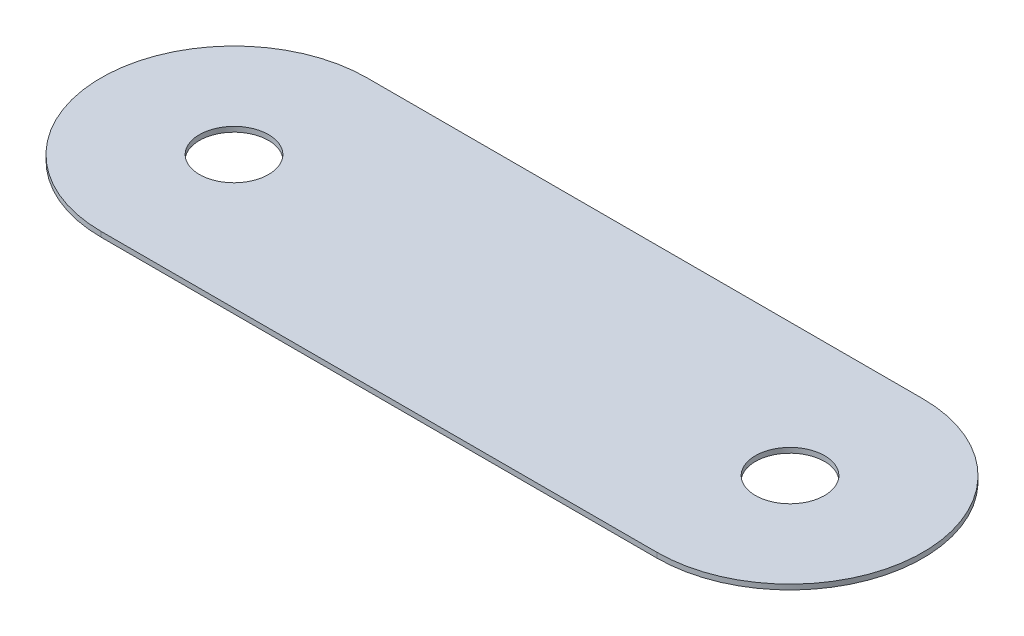
ISO-10303-21;
HEADER;
FILE_DESCRIPTION(('STEP AP214'),'2;1');
FILE_NAME('part.step','',(''),(''),'','','');
FILE_SCHEMA(('AUTOMOTIVE_DESIGN { 1 0 10303 214 1 1 1 1 }'));
ENDSEC;
DATA;
#1=APPLICATION_CONTEXT('core data for automotive mechanical design processes');
#2=APPLICATION_PROTOCOL_DEFINITION('international standard','automotive_design',2000,#1);
#3=PRODUCT_CONTEXT('',#1,'mechanical');
#4=PRODUCT('Part','Part','',(#3));
#5=PRODUCT_RELATED_PRODUCT_CATEGORY('part','',(#4));
#6=PRODUCT_DEFINITION_FORMATION('','',#4);
#7=PRODUCT_DEFINITION_CONTEXT('part definition',#1,'design');
#8=PRODUCT_DEFINITION('design','',#6,#7);
#9=PRODUCT_DEFINITION_SHAPE('','',#8);
#10=(LENGTH_UNIT() NAMED_UNIT(*) SI_UNIT(.MILLI.,.METRE.));
#11=(NAMED_UNIT(*) PLANE_ANGLE_UNIT() SI_UNIT($,.RADIAN.));
#12=(NAMED_UNIT(*) SI_UNIT($,.STERADIAN.) SOLID_ANGLE_UNIT());
#13=UNCERTAINTY_MEASURE_WITH_UNIT(LENGTH_MEASURE(1.E-05),#10,'distance_accuracy_value','');
#14=(GEOMETRIC_REPRESENTATION_CONTEXT(3) GLOBAL_UNCERTAINTY_ASSIGNED_CONTEXT((#13)) GLOBAL_UNIT_ASSIGNED_CONTEXT((#10,
#11,#12)) REPRESENTATION_CONTEXT('',''));
#15=CARTESIAN_POINT('',(0.,0.,0.));
#16=DIRECTION('',(0.,0.,1.));
#17=DIRECTION('',(1.,0.,0.));
#18=AXIS2_PLACEMENT_3D('',#15,#16,#17);
#19=CARTESIAN_POINT('',(-173.489347258247,-1097.01950326046,-540.255431386205));
#20=DIRECTION('',(0.,-1.,0.));
#21=DIRECTION('',(0.,0.,-1.));
#22=AXIS2_PLACEMENT_3D('',#19,#20,#21);
#23=PLANE('',#22);
#24=CARTESIAN_POINT('',(424.243135792496,-1097.01950326046,-540.255431386205));
#25=DIRECTION('',(0.,-1.,0.));
#26=DIRECTION('',(0.,0.,-1.));
#27=AXIS2_PLACEMENT_3D('',#24,#25,#26);
#28=CIRCLE('',#27,6.5);
#29=CARTESIAN_POINT('',(424.243135792496,-1097.01950326046,-546.755431386205));
#30=VERTEX_POINT('',#29);
#31=EDGE_CURVE('E88',#30,#30,#28,.T.);
#32=ORIENTED_EDGE('',*,*,#31,.T.);
#33=EDGE_LOOP('',(#32));
#34=FACE_BOUND('',#33,.T.);
#35=CARTESIAN_POINT('',(528.778168984527,-1097.01950326046,-540.255431386205));
#36=DIRECTION('',(0.,-1.,0.));
#37=DIRECTION('',(0.,0.,-1.));
#38=AXIS2_PLACEMENT_3D('',#35,#36,#37);
#39=CIRCLE('',#38,6.5);
#40=CARTESIAN_POINT('',(528.778168984527,-1097.01950326046,-546.755431386205));
#41=VERTEX_POINT('',#40);
#42=EDGE_CURVE('E91',#41,#41,#39,.T.);
#43=ORIENTED_EDGE('',*,*,#42,.T.);
#44=EDGE_LOOP('',(#43));
#45=FACE_BOUND('',#44,.T.);
#46=DIRECTION('',(1.,0.,0.));
#47=VECTOR('',#46,1.);
#48=CARTESIAN_POINT('',(424.243135792496,-1097.01950326046,-515.255431386205));
#49=LINE('',#48,#47);
#50=CARTESIAN_POINT('',(528.778168984527,-1097.01950326046,-515.255431386205));
#51=VERTEX_POINT('',#50);
#52=CARTESIAN_POINT('',(424.243135792496,-1097.01950326046,-515.255431386205));
#53=VERTEX_POINT('',#52);
#54=EDGE_CURVE('E57',#51,#53,#49,.F.);
#55=ORIENTED_EDGE('',*,*,#54,.F.);
#56=CARTESIAN_POINT('',(528.778168984527,-1097.01950326046,-540.255431386205));
#57=DIRECTION('',(0.,-1.,0.));
#58=DIRECTION('',(0.,0.,-1.));
#59=AXIS2_PLACEMENT_3D('',#56,#57,#58);
#60=CIRCLE('',#59,25.);
#61=CARTESIAN_POINT('',(528.778168984527,-1097.01950326046,-565.255431386205));
#62=VERTEX_POINT('',#61);
#63=EDGE_CURVE('E20',#62,#51,#60,.T.);
#64=ORIENTED_EDGE('',*,*,#63,.F.);
#65=DIRECTION('',(-1.,0.,0.));
#66=VECTOR('',#65,1.);
#67=CARTESIAN_POINT('',(528.778168984527,-1097.01950326046,-565.255431386205));
#68=LINE('',#67,#66);
#69=CARTESIAN_POINT('',(424.243135792496,-1097.01950326046,-565.255431386205));
#70=VERTEX_POINT('',#69);
#71=EDGE_CURVE('E68',#70,#62,#68,.F.);
#72=ORIENTED_EDGE('',*,*,#71,.F.);
#73=CARTESIAN_POINT('',(424.243135792496,-1097.01950326046,-540.255431386205));
#74=DIRECTION('',(0.,-1.,0.));
#75=DIRECTION('',(0.,0.,-1.));
#76=AXIS2_PLACEMENT_3D('',#73,#74,#75);
#77=CIRCLE('',#76,25.);
#78=EDGE_CURVE('E59',#53,#70,#77,.T.);
#79=ORIENTED_EDGE('',*,*,#78,.F.);
#80=EDGE_LOOP('',(#55,#64,#72,#79));
#81=FACE_BOUND('',#80,.T.);
#82=ADVANCED_FACE('F17',(#34,#45,#81),#23,.F.);
#83=CARTESIAN_POINT('',(528.778168984527,-1097.01950326046,-565.255431386205));
#84=DIRECTION('',(0.,0.,-1.));
#85=DIRECTION('',(-1.,0.,0.));
#86=AXIS2_PLACEMENT_3D('',#83,#84,#85);
#87=PLANE('',#86);
#88=DIRECTION('',(1.,0.,0.));
#89=VECTOR('',#88,1.);
#90=CARTESIAN_POINT('',(-173.489347258247,-1097.97200326046,-565.255431386205));
#91=LINE('',#90,#89);
#92=CARTESIAN_POINT('',(424.243135792496,-1097.97200326046,-565.255431386205));
#93=VERTEX_POINT('',#92);
#94=CARTESIAN_POINT('',(528.778168984527,-1097.97200326046,-565.255431386205));
#95=VERTEX_POINT('',#94);
#96=EDGE_CURVE('E87',#93,#95,#91,.T.);
#97=ORIENTED_EDGE('',*,*,#96,.F.);
#98=DIRECTION('',(0.,-1.,0.));
#99=VECTOR('',#98,1.);
#100=CARTESIAN_POINT('',(424.243135792496,-1097.01950326046,-565.255431386205));
#101=LINE('',#100,#99);
#102=EDGE_CURVE('E74',#70,#93,#101,.T.);
#103=ORIENTED_EDGE('',*,*,#102,.F.);
#104=ORIENTED_EDGE('',*,*,#71,.T.);
#105=DIRECTION('',(0.,-1.,0.));
#106=VECTOR('',#105,1.);
#107=CARTESIAN_POINT('',(528.778168984527,-1097.01950326046,-565.255431386205));
#108=LINE('',#107,#106);
#109=EDGE_CURVE('E62',#95,#62,#108,.F.);
#110=ORIENTED_EDGE('',*,*,#109,.F.);
#111=EDGE_LOOP('',(#97,#103,#104,#110));
#112=FACE_BOUND('',#111,.T.);
#113=ADVANCED_FACE('F104',(#112),#87,.T.);
#114=CARTESIAN_POINT('',(528.778168984527,-1097.01950326046,-540.255431386205));
#115=DIRECTION('',(0.,-1.,0.));
#116=DIRECTION('',(0.,0.,-1.));
#117=AXIS2_PLACEMENT_3D('',#114,#115,#116);
#118=CYLINDRICAL_SURFACE('',#117,25.);
#119=CARTESIAN_POINT('',(528.778168984527,-1097.97200326046,-540.255431386205));
#120=DIRECTION('',(0.,-1.,0.));
#121=DIRECTION('',(0.,0.,-1.));
#122=AXIS2_PLACEMENT_3D('',#119,#120,#121);
#123=CIRCLE('',#122,25.);
#124=CARTESIAN_POINT('',(528.778168984527,-1097.97200326046,-515.255431386205));
#125=VERTEX_POINT('',#124);
#126=EDGE_CURVE('E85',#95,#125,#123,.T.);
#127=ORIENTED_EDGE('',*,*,#126,.F.);
#128=ORIENTED_EDGE('',*,*,#109,.T.);
#129=ORIENTED_EDGE('',*,*,#63,.T.);
#130=DIRECTION('',(0.,1.,0.));
#131=VECTOR('',#130,1.);
#132=CARTESIAN_POINT('',(528.778168984527,-1097.01950326046,-515.255431386205));
#133=LINE('',#132,#131);
#134=EDGE_CURVE('E61',#125,#51,#133,.T.);
#135=ORIENTED_EDGE('',*,*,#134,.F.);
#136=EDGE_LOOP('',(#127,#128,#129,#135));
#137=FACE_BOUND('',#136,.T.);
#138=ADVANCED_FACE('F67',(#137),#118,.T.);
#139=CARTESIAN_POINT('',(424.243135792496,-1097.01950326046,-515.255431386205));
#140=DIRECTION('',(0.,0.,1.));
#141=DIRECTION('',(1.,0.,0.));
#142=AXIS2_PLACEMENT_3D('',#139,#140,#141);
#143=PLANE('',#142);
#144=DIRECTION('',(1.,0.,0.));
#145=VECTOR('',#144,1.);
#146=CARTESIAN_POINT('',(-173.489347258247,-1097.97200326046,-515.255431386205));
#147=LINE('',#146,#145);
#148=CARTESIAN_POINT('',(424.243135792496,-1097.97200326046,-515.255431386205));
#149=VERTEX_POINT('',#148);
#150=EDGE_CURVE('E71',#125,#149,#147,.F.);
#151=ORIENTED_EDGE('',*,*,#150,.F.);
#152=ORIENTED_EDGE('',*,*,#134,.T.);
#153=ORIENTED_EDGE('',*,*,#54,.T.);
#154=DIRECTION('',(0.,-1.,0.));
#155=VECTOR('',#154,1.);
#156=CARTESIAN_POINT('',(424.243135792496,-1097.01950326046,-515.255431386205));
#157=LINE('',#156,#155);
#158=EDGE_CURVE('E35',#149,#53,#157,.F.);
#159=ORIENTED_EDGE('',*,*,#158,.F.);
#160=EDGE_LOOP('',(#151,#152,#153,#159));
#161=FACE_BOUND('',#160,.T.);
#162=ADVANCED_FACE('F69',(#161),#143,.T.);
#163=CARTESIAN_POINT('',(424.243135792496,-1097.01950326046,-540.255431386205));
#164=DIRECTION('',(0.,-1.,0.));
#165=DIRECTION('',(0.,0.,-1.));
#166=AXIS2_PLACEMENT_3D('',#163,#164,#165);
#167=CYLINDRICAL_SURFACE('',#166,25.);
#168=CARTESIAN_POINT('',(424.243135792496,-1097.97200326046,-540.255431386205));
#169=DIRECTION('',(0.,-1.,0.));
#170=DIRECTION('',(0.,0.,-1.));
#171=AXIS2_PLACEMENT_3D('',#168,#169,#170);
#172=CIRCLE('',#171,25.);
#173=EDGE_CURVE('E82',#149,#93,#172,.T.);
#174=ORIENTED_EDGE('',*,*,#173,.F.);
#175=ORIENTED_EDGE('',*,*,#158,.T.);
#176=ORIENTED_EDGE('',*,*,#78,.T.);
#177=ORIENTED_EDGE('',*,*,#102,.T.);
#178=EDGE_LOOP('',(#174,#175,#176,#177));
#179=FACE_BOUND('',#178,.T.);
#180=ADVANCED_FACE('F105',(#179),#167,.T.);
#181=CARTESIAN_POINT('',(528.778168984527,-1097.01950326046,-540.255431386205));
#182=DIRECTION('',(0.,-1.,0.));
#183=DIRECTION('',(0.,0.,-1.));
#184=AXIS2_PLACEMENT_3D('',#181,#182,#183);
#185=CYLINDRICAL_SURFACE('',#184,6.5);
#186=CARTESIAN_POINT('',(528.778168984527,-1097.97200326046,-540.255431386205));
#187=DIRECTION('',(0.,-1.,0.));
#188=DIRECTION('',(0.,0.,-1.));
#189=AXIS2_PLACEMENT_3D('',#186,#187,#188);
#190=CIRCLE('',#189,6.5);
#191=CARTESIAN_POINT('',(528.778168984527,-1097.97200326046,-546.755431386205));
#192=VERTEX_POINT('',#191);
#193=EDGE_CURVE('E26',#192,#192,#190,.F.);
#194=ORIENTED_EDGE('',*,*,#193,.F.);
#195=EDGE_LOOP('',(#194));
#196=FACE_BOUND('',#195,.T.);
#197=ORIENTED_EDGE('',*,*,#42,.F.);
#198=EDGE_LOOP('',(#197));
#199=FACE_BOUND('',#198,.T.);
#200=ADVANCED_FACE('F107',(#196,#199),#185,.F.);
#201=CARTESIAN_POINT('',(424.243135792496,-1097.01950326046,-540.255431386205));
#202=DIRECTION('',(0.,-1.,0.));
#203=DIRECTION('',(0.,0.,-1.));
#204=AXIS2_PLACEMENT_3D('',#201,#202,#203);
#205=CYLINDRICAL_SURFACE('',#204,6.5);
#206=CARTESIAN_POINT('',(424.243135792496,-1097.97200326046,-540.255431386205));
#207=DIRECTION('',(0.,-1.,0.));
#208=DIRECTION('',(0.,0.,-1.));
#209=AXIS2_PLACEMENT_3D('',#206,#207,#208);
#210=CIRCLE('',#209,6.5);
#211=CARTESIAN_POINT('',(424.243135792496,-1097.97200326046,-546.755431386205));
#212=VERTEX_POINT('',#211);
#213=EDGE_CURVE('E11',#212,#212,#210,.F.);
#214=ORIENTED_EDGE('',*,*,#213,.F.);
#215=EDGE_LOOP('',(#214));
#216=FACE_BOUND('',#215,.T.);
#217=ORIENTED_EDGE('',*,*,#31,.F.);
#218=EDGE_LOOP('',(#217));
#219=FACE_BOUND('',#218,.T.);
#220=ADVANCED_FACE('F114',(#216,#219),#205,.F.);
#221=CARTESIAN_POINT('',(-173.489347258247,-1097.97200326046,-540.255431386205));
#222=DIRECTION('',(0.,-1.,0.));
#223=DIRECTION('',(0.,0.,-1.));
#224=AXIS2_PLACEMENT_3D('',#221,#222,#223);
#225=PLANE('',#224);
#226=ORIENTED_EDGE('',*,*,#213,.T.);
#227=EDGE_LOOP('',(#226));
#228=FACE_BOUND('',#227,.T.);
#229=ORIENTED_EDGE('',*,*,#193,.T.);
#230=EDGE_LOOP('',(#229));
#231=FACE_BOUND('',#230,.T.);
#232=ORIENTED_EDGE('',*,*,#150,.T.);
#233=ORIENTED_EDGE('',*,*,#173,.T.);
#234=ORIENTED_EDGE('',*,*,#96,.T.);
#235=ORIENTED_EDGE('',*,*,#126,.T.);
#236=EDGE_LOOP('',(#232,#233,#234,#235));
#237=FACE_BOUND('',#236,.T.);
#238=ADVANCED_FACE('F102',(#228,#231,#237),#225,.T.);
#239=CLOSED_SHELL('',(#82,#113,#138,#162,#180,#200,#220,#238));
#240=MANIFOLD_SOLID_BREP('B1',#239);
#241=ADVANCED_BREP_SHAPE_REPRESENTATION('',(#18,#240),#14);
#242=SHAPE_DEFINITION_REPRESENTATION(#9,#241);
ENDSEC;
END-ISO-10303-21;
